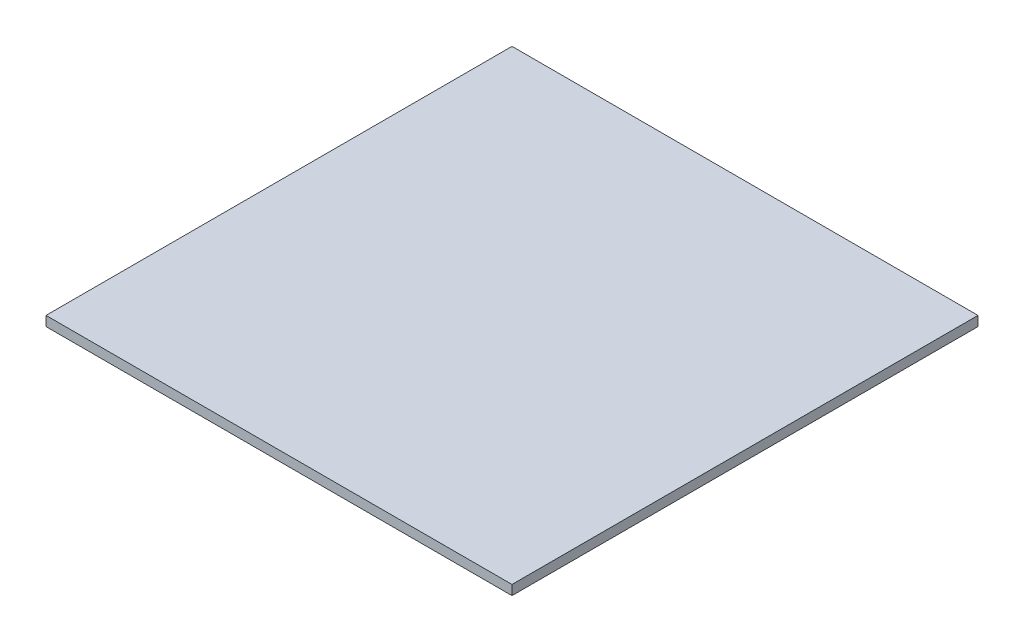
ISO-10303-21;
HEADER;
FILE_DESCRIPTION(('STEP AP214'),'2;1');
FILE_NAME('part.step','',(''),(''),'','','');
FILE_SCHEMA(('AUTOMOTIVE_DESIGN { 1 0 10303 214 1 1 1 1 }'));
ENDSEC;
DATA;
#1=APPLICATION_CONTEXT('core data for automotive mechanical design processes');
#2=APPLICATION_PROTOCOL_DEFINITION('international standard','automotive_design',2000,#1);
#3=PRODUCT_CONTEXT('',#1,'mechanical');
#4=PRODUCT('Part','Part','',(#3));
#5=PRODUCT_RELATED_PRODUCT_CATEGORY('part','',(#4));
#6=PRODUCT_DEFINITION_FORMATION('','',#4);
#7=PRODUCT_DEFINITION_CONTEXT('part definition',#1,'design');
#8=PRODUCT_DEFINITION('design','',#6,#7);
#9=PRODUCT_DEFINITION_SHAPE('','',#8);
#10=(LENGTH_UNIT() NAMED_UNIT(*) SI_UNIT(.MILLI.,.METRE.));
#11=(NAMED_UNIT(*) PLANE_ANGLE_UNIT() SI_UNIT($,.RADIAN.));
#12=(NAMED_UNIT(*) SI_UNIT($,.STERADIAN.) SOLID_ANGLE_UNIT());
#13=UNCERTAINTY_MEASURE_WITH_UNIT(LENGTH_MEASURE(1.E-05),#10,'distance_accuracy_value','');
#14=(GEOMETRIC_REPRESENTATION_CONTEXT(3) GLOBAL_UNCERTAINTY_ASSIGNED_CONTEXT((#13)) GLOBAL_UNIT_ASSIGNED_CONTEXT((#10,
#11,#12)) REPRESENTATION_CONTEXT('',''));
#15=CARTESIAN_POINT('',(0.,0.,0.));
#16=DIRECTION('',(0.,0.,1.));
#17=DIRECTION('',(1.,0.,0.));
#18=AXIS2_PLACEMENT_3D('',#15,#16,#17);
#19=CARTESIAN_POINT('',(-76.2,1.58749999999999,76.2));
#20=DIRECTION('',(1.,0.,0.));
#21=DIRECTION('',(0.,0.,-1.));
#22=AXIS2_PLACEMENT_3D('',#19,#20,#21);
#23=PLANE('',#22);
#24=DIRECTION('',(0.,-1.,0.));
#25=VECTOR('',#24,1.);
#26=CARTESIAN_POINT('',(-76.2,1.58749999999999,-76.2));
#27=LINE('',#26,#25);
#28=CARTESIAN_POINT('',(-76.2,1.58749999999999,-76.2));
#29=VERTEX_POINT('',#28);
#30=CARTESIAN_POINT('',(-76.2,-1.58750000000001,-76.2));
#31=VERTEX_POINT('',#30);
#32=EDGE_CURVE('E96',#29,#31,#27,.T.);
#33=ORIENTED_EDGE('',*,*,#32,.T.);
#34=DIRECTION('',(0.,0.,-1.));
#35=VECTOR('',#34,1.);
#36=CARTESIAN_POINT('',(-76.2,-1.58750000000001,76.2));
#37=LINE('',#36,#35);
#38=CARTESIAN_POINT('',(-76.2,-1.58750000000001,76.2));
#39=VERTEX_POINT('',#38);
#40=EDGE_CURVE('E11',#39,#31,#37,.T.);
#41=ORIENTED_EDGE('',*,*,#40,.F.);
#42=DIRECTION('',(0.,-1.,0.));
#43=VECTOR('',#42,1.);
#44=CARTESIAN_POINT('',(-76.2,1.58749999999999,76.2));
#45=LINE('',#44,#43);
#46=CARTESIAN_POINT('',(-76.2,1.58749999999999,76.2));
#47=VERTEX_POINT('',#46);
#48=EDGE_CURVE('E84',#47,#39,#45,.T.);
#49=ORIENTED_EDGE('',*,*,#48,.F.);
#50=DIRECTION('',(0.,0.,-1.));
#51=VECTOR('',#50,1.);
#52=CARTESIAN_POINT('',(-76.2,1.58749999999999,76.2));
#53=LINE('',#52,#51);
#54=EDGE_CURVE('E92',#47,#29,#53,.T.);
#55=ORIENTED_EDGE('',*,*,#54,.T.);
#56=EDGE_LOOP('',(#33,#41,#49,#55));
#57=FACE_BOUND('',#56,.T.);
#58=ADVANCED_FACE('F33',(#57),#23,.F.);
#59=CARTESIAN_POINT('',(76.2,-1.58749999999999,76.2));
#60=DIRECTION('',(0.,1.,0.));
#61=DIRECTION('',(-1.,0.,0.));
#62=AXIS2_PLACEMENT_3D('',#59,#60,#61);
#63=PLANE('',#62);
#64=DIRECTION('',(1.,0.,0.));
#65=VECTOR('',#64,1.);
#66=CARTESIAN_POINT('',(76.2,-1.58749999999999,-76.2));
#67=LINE('',#66,#65);
#68=CARTESIAN_POINT('',(76.2,-1.58749999999999,-76.2));
#69=VERTEX_POINT('',#68);
#70=EDGE_CURVE('E88',#31,#69,#67,.T.);
#71=ORIENTED_EDGE('',*,*,#70,.T.);
#72=DIRECTION('',(0.,0.,-1.));
#73=VECTOR('',#72,1.);
#74=CARTESIAN_POINT('',(76.2,-1.58749999999999,76.2));
#75=LINE('',#74,#73);
#76=CARTESIAN_POINT('',(76.2,-1.58749999999999,76.2));
#77=VERTEX_POINT('',#76);
#78=EDGE_CURVE('E41',#77,#69,#75,.T.);
#79=ORIENTED_EDGE('',*,*,#78,.F.);
#80=DIRECTION('',(1.,0.,0.));
#81=VECTOR('',#80,1.);
#82=CARTESIAN_POINT('',(76.2,-1.58749999999999,76.2));
#83=LINE('',#82,#81);
#84=EDGE_CURVE('E79',#39,#77,#83,.T.);
#85=ORIENTED_EDGE('',*,*,#84,.F.);
#86=ORIENTED_EDGE('',*,*,#40,.T.);
#87=EDGE_LOOP('',(#71,#79,#85,#86));
#88=FACE_BOUND('',#87,.T.);
#89=ADVANCED_FACE('F87',(#88),#63,.F.);
#90=CARTESIAN_POINT('',(76.2,1.58750000000001,76.2));
#91=DIRECTION('',(-1.,0.,0.));
#92=DIRECTION('',(0.,0.,1.));
#93=AXIS2_PLACEMENT_3D('',#90,#91,#92);
#94=PLANE('',#93);
#95=DIRECTION('',(0.,1.,0.));
#96=VECTOR('',#95,1.);
#97=CARTESIAN_POINT('',(76.2,1.58750000000001,-76.2));
#98=LINE('',#97,#96);
#99=CARTESIAN_POINT('',(76.2,1.58750000000001,-76.2));
#100=VERTEX_POINT('',#99);
#101=EDGE_CURVE('E66',#69,#100,#98,.T.);
#102=ORIENTED_EDGE('',*,*,#101,.T.);
#103=DIRECTION('',(0.,0.,-1.));
#104=VECTOR('',#103,1.);
#105=CARTESIAN_POINT('',(76.2,1.58750000000001,76.2));
#106=LINE('',#105,#104);
#107=CARTESIAN_POINT('',(76.2,1.58750000000001,76.2));
#108=VERTEX_POINT('',#107);
#109=EDGE_CURVE('E89',#108,#100,#106,.T.);
#110=ORIENTED_EDGE('',*,*,#109,.F.);
#111=DIRECTION('',(0.,1.,0.));
#112=VECTOR('',#111,1.);
#113=CARTESIAN_POINT('',(76.2,1.58750000000001,76.2));
#114=LINE('',#113,#112);
#115=EDGE_CURVE('E82',#77,#108,#114,.T.);
#116=ORIENTED_EDGE('',*,*,#115,.F.);
#117=ORIENTED_EDGE('',*,*,#78,.T.);
#118=EDGE_LOOP('',(#102,#110,#116,#117));
#119=FACE_BOUND('',#118,.T.);
#120=ADVANCED_FACE('F90',(#119),#94,.F.);
#121=CARTESIAN_POINT('',(76.2,1.58750000000001,76.2));
#122=DIRECTION('',(0.,-1.,0.));
#123=DIRECTION('',(1.,0.,0.));
#124=AXIS2_PLACEMENT_3D('',#121,#122,#123);
#125=PLANE('',#124);
#126=DIRECTION('',(-1.,0.,0.));
#127=VECTOR('',#126,1.);
#128=CARTESIAN_POINT('',(76.2,1.58750000000001,-76.2));
#129=LINE('',#128,#127);
#130=EDGE_CURVE('E72',#100,#29,#129,.T.);
#131=ORIENTED_EDGE('',*,*,#130,.T.);
#132=ORIENTED_EDGE('',*,*,#54,.F.);
#133=DIRECTION('',(-1.,0.,0.));
#134=VECTOR('',#133,1.);
#135=CARTESIAN_POINT('',(76.2,1.58750000000001,76.2));
#136=LINE('',#135,#134);
#137=EDGE_CURVE('E49',#108,#47,#136,.T.);
#138=ORIENTED_EDGE('',*,*,#137,.F.);
#139=ORIENTED_EDGE('',*,*,#109,.T.);
#140=EDGE_LOOP('',(#131,#132,#138,#139));
#141=FACE_BOUND('',#140,.T.);
#142=ADVANCED_FACE('F103',(#141),#125,.F.);
#143=CARTESIAN_POINT('',(0.,0.,76.2));
#144=DIRECTION('',(0.,0.,-1.));
#145=DIRECTION('',(-1.,0.,0.));
#146=AXIS2_PLACEMENT_3D('',#143,#144,#145);
#147=PLANE('',#146);
#148=ORIENTED_EDGE('',*,*,#48,.T.);
#149=ORIENTED_EDGE('',*,*,#84,.T.);
#150=ORIENTED_EDGE('',*,*,#115,.T.);
#151=ORIENTED_EDGE('',*,*,#137,.T.);
#152=EDGE_LOOP('',(#148,#149,#150,#151));
#153=FACE_BOUND('',#152,.T.);
#154=ADVANCED_FACE('F80',(#153),#147,.F.);
#155=CARTESIAN_POINT('',(0.,0.,-76.2));
#156=DIRECTION('',(0.,0.,-1.));
#157=DIRECTION('',(-1.,0.,0.));
#158=AXIS2_PLACEMENT_3D('',#155,#156,#157);
#159=PLANE('',#158);
#160=ORIENTED_EDGE('',*,*,#32,.F.);
#161=ORIENTED_EDGE('',*,*,#130,.F.);
#162=ORIENTED_EDGE('',*,*,#101,.F.);
#163=ORIENTED_EDGE('',*,*,#70,.F.);
#164=EDGE_LOOP('',(#160,#161,#162,#163));
#165=FACE_BOUND('',#164,.T.);
#166=ADVANCED_FACE('F106',(#165),#159,.T.);
#167=CLOSED_SHELL('',(#58,#89,#120,#142,#154,#166));
#168=MANIFOLD_SOLID_BREP('B2',#167);
#169=ADVANCED_BREP_SHAPE_REPRESENTATION('',(#18,#168),#14);
#170=SHAPE_DEFINITION_REPRESENTATION(#9,#169);
ENDSEC;
END-ISO-10303-21;
